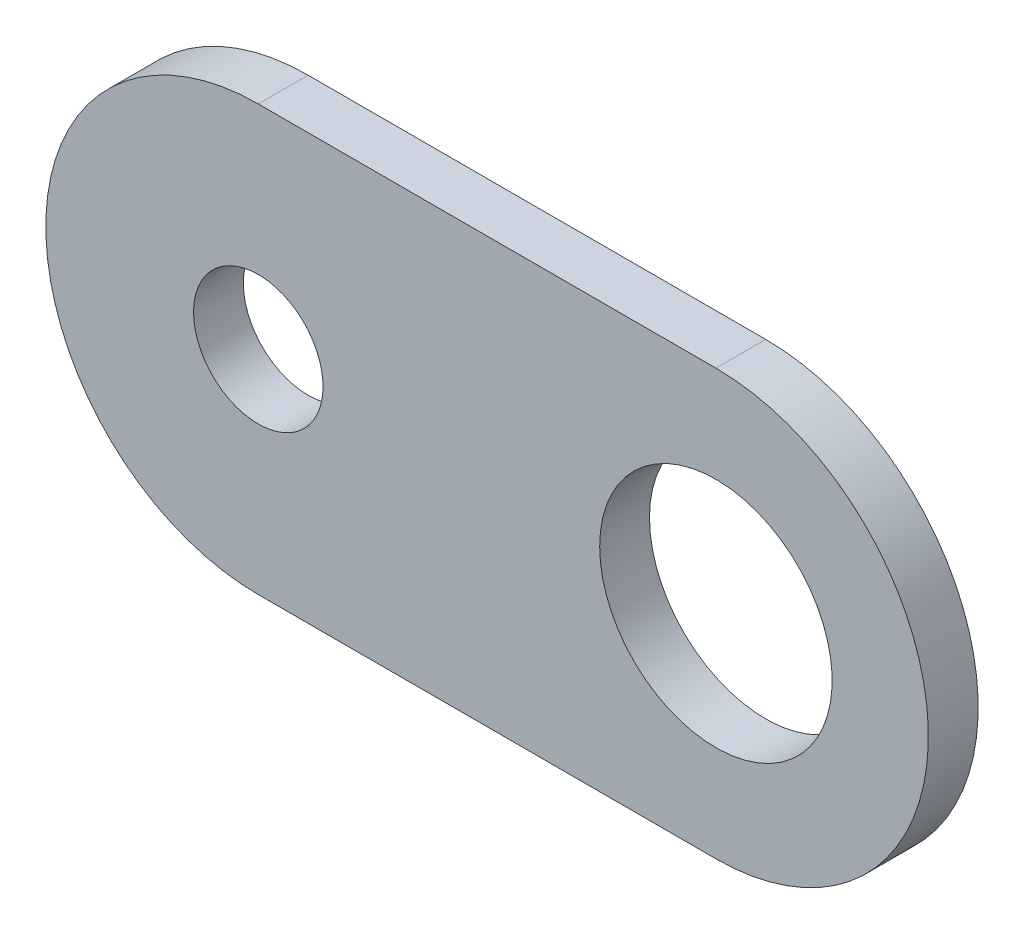
ISO-10303-21;
HEADER;
FILE_DESCRIPTION(('STEP AP214'),'2;1');
FILE_NAME('part.step','',(''),(''),'','','');
FILE_SCHEMA(('AUTOMOTIVE_DESIGN { 1 0 10303 214 1 1 1 1 }'));
ENDSEC;
DATA;
#1=APPLICATION_CONTEXT('core data for automotive mechanical design processes');
#2=APPLICATION_PROTOCOL_DEFINITION('international standard','automotive_design',2000,#1);
#3=PRODUCT_CONTEXT('',#1,'mechanical');
#4=PRODUCT('Part','Part','',(#3));
#5=PRODUCT_RELATED_PRODUCT_CATEGORY('part','',(#4));
#6=PRODUCT_DEFINITION_FORMATION('','',#4);
#7=PRODUCT_DEFINITION_CONTEXT('part definition',#1,'design');
#8=PRODUCT_DEFINITION('design','',#6,#7);
#9=PRODUCT_DEFINITION_SHAPE('','',#8);
#10=(LENGTH_UNIT() NAMED_UNIT(*) SI_UNIT(.MILLI.,.METRE.));
#11=(NAMED_UNIT(*) PLANE_ANGLE_UNIT() SI_UNIT($,.RADIAN.));
#12=(NAMED_UNIT(*) SI_UNIT($,.STERADIAN.) SOLID_ANGLE_UNIT());
#13=UNCERTAINTY_MEASURE_WITH_UNIT(LENGTH_MEASURE(1.E-05),#10,'distance_accuracy_value','');
#14=(GEOMETRIC_REPRESENTATION_CONTEXT(3) GLOBAL_UNCERTAINTY_ASSIGNED_CONTEXT((#13)) GLOBAL_UNIT_ASSIGNED_CONTEXT((#10,
#11,#12)) REPRESENTATION_CONTEXT('',''));
#15=CARTESIAN_POINT('',(0.,0.,0.));
#16=DIRECTION('',(0.,0.,1.));
#17=DIRECTION('',(1.,0.,0.));
#18=AXIS2_PLACEMENT_3D('',#15,#16,#17);
#19=CARTESIAN_POINT('',(-17.5,0.,3.81));
#20=DIRECTION('',(0.,0.,-1.));
#21=DIRECTION('',(-1.,0.,0.));
#22=AXIS2_PLACEMENT_3D('',#19,#20,#21);
#23=PLANE('',#22);
#24=CARTESIAN_POINT('',(-17.5,0.,3.81));
#25=DIRECTION('',(0.,0.,1.));
#26=DIRECTION('',(-1.,0.,0.));
#27=AXIS2_PLACEMENT_3D('',#24,#25,#26);
#28=CIRCLE('',#27,16.250000012);
#29=CARTESIAN_POINT('',(-17.5,16.250000012,3.81));
#30=VERTEX_POINT('',#29);
#31=CARTESIAN_POINT('',(-17.5,-16.250000012,3.81));
#32=VERTEX_POINT('',#31);
#33=EDGE_CURVE('E84',#30,#32,#28,.T.);
#34=ORIENTED_EDGE('',*,*,#33,.T.);
#35=DIRECTION('',(1.,0.,0.));
#36=VECTOR('',#35,1.);
#37=CARTESIAN_POINT('',(17.5,-16.250000012,3.81));
#38=LINE('',#37,#36);
#39=CARTESIAN_POINT('',(17.5,-16.250000012,3.81));
#40=VERTEX_POINT('',#39);
#41=EDGE_CURVE('E79',#32,#40,#38,.T.);
#42=ORIENTED_EDGE('',*,*,#41,.T.);
#43=CARTESIAN_POINT('',(17.5,0.,3.81));
#44=DIRECTION('',(0.,0.,1.));
#45=DIRECTION('',(-1.,0.,0.));
#46=AXIS2_PLACEMENT_3D('',#43,#44,#45);
#47=CIRCLE('',#46,16.250000012);
#48=CARTESIAN_POINT('',(17.5,16.250000012,3.81));
#49=VERTEX_POINT('',#48);
#50=EDGE_CURVE('E82',#40,#49,#47,.T.);
#51=ORIENTED_EDGE('',*,*,#50,.T.);
#52=DIRECTION('',(-1.,0.,0.));
#53=VECTOR('',#52,1.);
#54=CARTESIAN_POINT('',(-17.5,16.250000012,3.81));
#55=LINE('',#54,#53);
#56=EDGE_CURVE('E49',#49,#30,#55,.T.);
#57=ORIENTED_EDGE('',*,*,#56,.T.);
#58=EDGE_LOOP('',(#34,#42,#51,#57));
#59=FACE_BOUND('',#58,.T.);
#60=CARTESIAN_POINT('',(-17.5,0.,3.81));
#61=DIRECTION('',(0.,0.,1.));
#62=DIRECTION('',(1.,0.,0.));
#63=AXIS2_PLACEMENT_3D('',#60,#61,#62);
#64=CIRCLE('',#63,4.953);
#65=CARTESIAN_POINT('',(-22.453,0.,3.81));
#66=VERTEX_POINT('',#65);
#67=EDGE_CURVE('E99',#66,#66,#64,.T.);
#68=ORIENTED_EDGE('',*,*,#67,.F.);
#69=EDGE_LOOP('',(#68));
#70=FACE_BOUND('',#69,.T.);
#71=CARTESIAN_POINT('',(17.5,0.,3.81));
#72=DIRECTION('',(0.,0.,1.));
#73=DIRECTION('',(1.,0.,0.));
#74=AXIS2_PLACEMENT_3D('',#71,#72,#73);
#75=CIRCLE('',#74,8.89000000000001);
#76=CARTESIAN_POINT('',(8.61,0.,3.81));
#77=VERTEX_POINT('',#76);
#78=EDGE_CURVE('E114',#77,#77,#75,.T.);
#79=ORIENTED_EDGE('',*,*,#78,.F.);
#80=EDGE_LOOP('',(#79));
#81=FACE_BOUND('',#80,.T.);
#82=ADVANCED_FACE('F32',(#59,#70,#81),#23,.F.);
#83=CARTESIAN_POINT('',(-17.5,0.,0.));
#84=DIRECTION('',(0.,0.,-1.));
#85=DIRECTION('',(-1.,0.,0.));
#86=AXIS2_PLACEMENT_3D('',#83,#84,#85);
#87=PLANE('',#86);
#88=CARTESIAN_POINT('',(-17.5,0.,0.));
#89=DIRECTION('',(0.,0.,1.));
#90=DIRECTION('',(1.,0.,0.));
#91=AXIS2_PLACEMENT_3D('',#88,#89,#90);
#92=CIRCLE('',#91,4.953);
#93=CARTESIAN_POINT('',(-22.453,0.,0.));
#94=VERTEX_POINT('',#93);
#95=EDGE_CURVE('E111',#94,#94,#92,.T.);
#96=ORIENTED_EDGE('',*,*,#95,.T.);
#97=EDGE_LOOP('',(#96));
#98=FACE_BOUND('',#97,.T.);
#99=CARTESIAN_POINT('',(-17.5,0.,0.));
#100=DIRECTION('',(0.,0.,1.));
#101=DIRECTION('',(-1.,0.,0.));
#102=AXIS2_PLACEMENT_3D('',#99,#100,#101);
#103=CIRCLE('',#102,16.250000012);
#104=CARTESIAN_POINT('',(-17.5,16.250000012,0.));
#105=VERTEX_POINT('',#104);
#106=CARTESIAN_POINT('',(-17.5,-16.250000012,0.));
#107=VERTEX_POINT('',#106);
#108=EDGE_CURVE('E96',#105,#107,#103,.T.);
#109=ORIENTED_EDGE('',*,*,#108,.F.);
#110=DIRECTION('',(-1.,0.,0.));
#111=VECTOR('',#110,1.);
#112=CARTESIAN_POINT('',(-17.5,16.250000012,0.));
#113=LINE('',#112,#111);
#114=CARTESIAN_POINT('',(17.5,16.250000012,0.));
#115=VERTEX_POINT('',#114);
#116=EDGE_CURVE('E72',#115,#105,#113,.T.);
#117=ORIENTED_EDGE('',*,*,#116,.F.);
#118=CARTESIAN_POINT('',(17.5,0.,0.));
#119=DIRECTION('',(0.,0.,1.));
#120=DIRECTION('',(-1.,0.,0.));
#121=AXIS2_PLACEMENT_3D('',#118,#119,#120);
#122=CIRCLE('',#121,16.250000012);
#123=CARTESIAN_POINT('',(17.5,-16.250000012,0.));
#124=VERTEX_POINT('',#123);
#125=EDGE_CURVE('E66',#124,#115,#122,.T.);
#126=ORIENTED_EDGE('',*,*,#125,.F.);
#127=DIRECTION('',(1.,0.,0.));
#128=VECTOR('',#127,1.);
#129=CARTESIAN_POINT('',(17.5,-16.250000012,0.));
#130=LINE('',#129,#128);
#131=EDGE_CURVE('E88',#107,#124,#130,.T.);
#132=ORIENTED_EDGE('',*,*,#131,.F.);
#133=EDGE_LOOP('',(#109,#117,#126,#132));
#134=FACE_BOUND('',#133,.T.);
#135=CARTESIAN_POINT('',(17.5,0.,0.));
#136=DIRECTION('',(0.,0.,1.));
#137=DIRECTION('',(1.,0.,0.));
#138=AXIS2_PLACEMENT_3D('',#135,#136,#137);
#139=CIRCLE('',#138,8.89000000000001);
#140=CARTESIAN_POINT('',(8.61,0.,0.));
#141=VERTEX_POINT('',#140);
#142=EDGE_CURVE('E117',#141,#141,#139,.T.);
#143=ORIENTED_EDGE('',*,*,#142,.T.);
#144=EDGE_LOOP('',(#143));
#145=FACE_BOUND('',#144,.T.);
#146=ADVANCED_FACE('F107',(#98,#134,#145),#87,.T.);
#147=CARTESIAN_POINT('',(-17.5,0.,3.81));
#148=DIRECTION('',(0.,0.,-1.));
#149=DIRECTION('',(-1.,0.,0.));
#150=AXIS2_PLACEMENT_3D('',#147,#148,#149);
#151=CYLINDRICAL_SURFACE('',#150,16.250000012);
#152=ORIENTED_EDGE('',*,*,#108,.T.);
#153=DIRECTION('',(0.,0.,-1.));
#154=VECTOR('',#153,1.);
#155=CARTESIAN_POINT('',(-17.5,-16.250000012,3.81));
#156=LINE('',#155,#154);
#157=EDGE_CURVE('E11',#32,#107,#156,.T.);
#158=ORIENTED_EDGE('',*,*,#157,.F.);
#159=ORIENTED_EDGE('',*,*,#33,.F.);
#160=DIRECTION('',(0.,0.,-1.));
#161=VECTOR('',#160,1.);
#162=CARTESIAN_POINT('',(-17.5,16.250000012,3.81));
#163=LINE('',#162,#161);
#164=EDGE_CURVE('E92',#30,#105,#163,.T.);
#165=ORIENTED_EDGE('',*,*,#164,.T.);
#166=EDGE_LOOP('',(#152,#158,#159,#165));
#167=FACE_BOUND('',#166,.T.);
#168=ADVANCED_FACE('F34',(#167),#151,.T.);
#169=CARTESIAN_POINT('',(17.5,-16.250000012,3.81));
#170=DIRECTION('',(0.,1.,0.));
#171=DIRECTION('',(0.,0.,1.));
#172=AXIS2_PLACEMENT_3D('',#169,#170,#171);
#173=PLANE('',#172);
#174=ORIENTED_EDGE('',*,*,#131,.T.);
#175=DIRECTION('',(0.,0.,-1.));
#176=VECTOR('',#175,1.);
#177=CARTESIAN_POINT('',(17.5,-16.250000012,3.81));
#178=LINE('',#177,#176);
#179=EDGE_CURVE('E41',#40,#124,#178,.T.);
#180=ORIENTED_EDGE('',*,*,#179,.F.);
#181=ORIENTED_EDGE('',*,*,#41,.F.);
#182=ORIENTED_EDGE('',*,*,#157,.T.);
#183=EDGE_LOOP('',(#174,#180,#181,#182));
#184=FACE_BOUND('',#183,.T.);
#185=ADVANCED_FACE('F87',(#184),#173,.F.);
#186=CARTESIAN_POINT('',(17.5,0.,3.81));
#187=DIRECTION('',(0.,0.,-1.));
#188=DIRECTION('',(-1.,0.,0.));
#189=AXIS2_PLACEMENT_3D('',#186,#187,#188);
#190=CYLINDRICAL_SURFACE('',#189,16.250000012);
#191=ORIENTED_EDGE('',*,*,#125,.T.);
#192=DIRECTION('',(0.,0.,-1.));
#193=VECTOR('',#192,1.);
#194=CARTESIAN_POINT('',(17.5,16.250000012,3.81));
#195=LINE('',#194,#193);
#196=EDGE_CURVE('E89',#49,#115,#195,.T.);
#197=ORIENTED_EDGE('',*,*,#196,.F.);
#198=ORIENTED_EDGE('',*,*,#50,.F.);
#199=ORIENTED_EDGE('',*,*,#179,.T.);
#200=EDGE_LOOP('',(#191,#197,#198,#199));
#201=FACE_BOUND('',#200,.T.);
#202=ADVANCED_FACE('F90',(#201),#190,.T.);
#203=CARTESIAN_POINT('',(-17.5,16.250000012,3.81));
#204=DIRECTION('',(0.,-1.,0.));
#205=DIRECTION('',(0.,0.,-1.));
#206=AXIS2_PLACEMENT_3D('',#203,#204,#205);
#207=PLANE('',#206);
#208=ORIENTED_EDGE('',*,*,#116,.T.);
#209=ORIENTED_EDGE('',*,*,#164,.F.);
#210=ORIENTED_EDGE('',*,*,#56,.F.);
#211=ORIENTED_EDGE('',*,*,#196,.T.);
#212=EDGE_LOOP('',(#208,#209,#210,#211));
#213=FACE_BOUND('',#212,.T.);
#214=ADVANCED_FACE('F104',(#213),#207,.F.);
#215=CARTESIAN_POINT('',(-17.5,0.,3.81));
#216=DIRECTION('',(0.,0.,-1.));
#217=DIRECTION('',(-1.,0.,0.));
#218=AXIS2_PLACEMENT_3D('',#215,#216,#217);
#219=CYLINDRICAL_SURFACE('',#218,4.953);
#220=CARTESIAN_POINT('',(-22.453,0.,3.81));
#221=CARTESIAN_POINT('',(-22.453,0.,3.7703125));
#222=CARTESIAN_POINT('',(-22.453,0.,3.730625));
#223=CARTESIAN_POINT('',(-22.453,0.,3.65125));
#224=CARTESIAN_POINT('',(-22.453,0.,3.6115625));
#225=CARTESIAN_POINT('',(-22.453,0.,3.5321875));
#226=CARTESIAN_POINT('',(-22.453,0.,3.4925));
#227=CARTESIAN_POINT('',(-22.453,0.,3.413125));
#228=CARTESIAN_POINT('',(-22.453,0.,3.3734375));
#229=CARTESIAN_POINT('',(-22.453,0.,3.2940625));
#230=CARTESIAN_POINT('',(-22.453,0.,3.254375));
#231=CARTESIAN_POINT('',(-22.453,0.,3.175));
#232=CARTESIAN_POINT('',(-22.453,0.,3.1353125));
#233=CARTESIAN_POINT('',(-22.453,0.,3.0559375));
#234=CARTESIAN_POINT('',(-22.453,0.,3.01625));
#235=CARTESIAN_POINT('',(-22.453,0.,2.936875));
#236=CARTESIAN_POINT('',(-22.453,0.,2.8971875));
#237=CARTESIAN_POINT('',(-22.453,0.,2.8178125));
#238=CARTESIAN_POINT('',(-22.453,0.,2.778125));
#239=CARTESIAN_POINT('',(-22.453,0.,2.69875));
#240=CARTESIAN_POINT('',(-22.453,0.,2.6590625));
#241=CARTESIAN_POINT('',(-22.453,0.,2.5796875));
#242=CARTESIAN_POINT('',(-22.453,0.,2.54));
#243=CARTESIAN_POINT('',(-22.453,0.,2.460625));
#244=CARTESIAN_POINT('',(-22.453,0.,2.4209375));
#245=CARTESIAN_POINT('',(-22.453,0.,2.3415625));
#246=CARTESIAN_POINT('',(-22.453,0.,2.301875));
#247=CARTESIAN_POINT('',(-22.453,0.,2.2225));
#248=CARTESIAN_POINT('',(-22.453,0.,2.1828125));
#249=CARTESIAN_POINT('',(-22.453,0.,2.1034375));
#250=CARTESIAN_POINT('',(-22.453,0.,2.06375));
#251=CARTESIAN_POINT('',(-22.453,0.,1.984375));
#252=CARTESIAN_POINT('',(-22.453,0.,1.9446875));
#253=CARTESIAN_POINT('',(-22.453,0.,1.8653125));
#254=CARTESIAN_POINT('',(-22.453,0.,1.825625));
#255=CARTESIAN_POINT('',(-22.453,0.,1.74625));
#256=CARTESIAN_POINT('',(-22.453,0.,1.7065625));
#257=CARTESIAN_POINT('',(-22.453,0.,1.6271875));
#258=CARTESIAN_POINT('',(-22.453,0.,1.5875));
#259=CARTESIAN_POINT('',(-22.453,0.,1.508125));
#260=CARTESIAN_POINT('',(-22.453,0.,1.4684375));
#261=CARTESIAN_POINT('',(-22.453,0.,1.3890625));
#262=CARTESIAN_POINT('',(-22.453,0.,1.349375));
#263=CARTESIAN_POINT('',(-22.453,0.,1.27));
#264=CARTESIAN_POINT('',(-22.453,0.,1.2303125));
#265=CARTESIAN_POINT('',(-22.453,0.,1.1509375));
#266=CARTESIAN_POINT('',(-22.453,0.,1.11125));
#267=CARTESIAN_POINT('',(-22.453,0.,1.031875));
#268=CARTESIAN_POINT('',(-22.453,0.,0.9921875));
#269=CARTESIAN_POINT('',(-22.453,0.,0.9128125));
#270=CARTESIAN_POINT('',(-22.453,0.,0.873125));
#271=CARTESIAN_POINT('',(-22.453,0.,0.79375));
#272=CARTESIAN_POINT('',(-22.453,0.,0.7540625));
#273=CARTESIAN_POINT('',(-22.453,0.,0.6746875));
#274=CARTESIAN_POINT('',(-22.453,0.,0.635));
#275=CARTESIAN_POINT('',(-22.453,0.,0.555625));
#276=CARTESIAN_POINT('',(-22.453,0.,0.5159375));
#277=CARTESIAN_POINT('',(-22.453,0.,0.4365625));
#278=CARTESIAN_POINT('',(-22.453,0.,0.396875));
#279=CARTESIAN_POINT('',(-22.453,0.,0.3175));
#280=CARTESIAN_POINT('',(-22.453,0.,0.2778125));
#281=CARTESIAN_POINT('',(-22.453,0.,0.1984375));
#282=CARTESIAN_POINT('',(-22.453,0.,0.15875));
#283=CARTESIAN_POINT('',(-22.453,0.,0.0793749999999999));
#284=CARTESIAN_POINT('',(-22.453,0.,0.0396874999999999));
#285=CARTESIAN_POINT('',(-22.453,0.,0.));
#286=B_SPLINE_CURVE_WITH_KNOTS('',3,(#220,#221,#222,#223,#224,#225,#226,#227,#228,#229,#230,
#231,#232,#233,#234,#235,#236,#237,#238,#239,#240,#241,#242,#243,#244,#245,#246,#247,#248,#249,
#250,#251,#252,#253,#254,#255,#256,#257,#258,#259,#260,#261,#262,#263,#264,#265,#266,#267,#268,
#269,#270,#271,#272,#273,#274,#275,#276,#277,#278,#279,#280,#281,#282,#283,#284,#285),
.UNSPECIFIED.,.F.,.F.,(4,2,2,2,2,2,2,2,2,2,2,2,2,2,2,2,2,2,2,2,2,2,2,2,2,2,2,2,2,2,2,2,4),(0.,
0.1190625,0.238125,0.3571875,0.47625,0.595312499999999,0.714375,0.833437499999999,
0.952499999999999,1.0715625,1.190625,1.3096875,1.42875,1.5478125,1.666875,1.7859375,1.905,
2.0240625,2.143125,2.2621875,2.38125,2.5003125,2.619375,2.7384375,2.8575,2.9765625,3.095625,
3.2146875,3.33375,3.4528125,3.571875,3.6909375,3.81),.UNSPECIFIED.);
#287=EDGE_CURVE('BSEAM134',#66,#94,#286,.T.);
#288=ORIENTED_EDGE('',*,*,#67,.T.);
#289=ORIENTED_EDGE('',*,*,#95,.F.);
#290=ORIENTED_EDGE('',*,*,#287,.T.);
#291=ORIENTED_EDGE('',*,*,#287,.F.);
#292=EDGE_LOOP('',(#288,#290,#289,#291));
#293=FACE_BOUND('',#292,.T.);
#294=ADVANCED_FACE('F134',(#293),#219,.F.);
#295=CARTESIAN_POINT('',(17.5,0.,3.81));
#296=DIRECTION('',(0.,0.,-1.));
#297=DIRECTION('',(-1.,0.,0.));
#298=AXIS2_PLACEMENT_3D('',#295,#296,#297);
#299=CYLINDRICAL_SURFACE('',#298,8.89000000000001);
#300=CARTESIAN_POINT('',(8.61,0.,3.81));
#301=CARTESIAN_POINT('',(8.61,0.,3.7703125));
#302=CARTESIAN_POINT('',(8.61,0.,3.730625));
#303=CARTESIAN_POINT('',(8.61,0.,3.65125));
#304=CARTESIAN_POINT('',(8.61,0.,3.6115625));
#305=CARTESIAN_POINT('',(8.61,0.,3.5321875));
#306=CARTESIAN_POINT('',(8.61,0.,3.4925));
#307=CARTESIAN_POINT('',(8.61,0.,3.413125));
#308=CARTESIAN_POINT('',(8.61,0.,3.3734375));
#309=CARTESIAN_POINT('',(8.61,0.,3.2940625));
#310=CARTESIAN_POINT('',(8.61,0.,3.254375));
#311=CARTESIAN_POINT('',(8.61,0.,3.175));
#312=CARTESIAN_POINT('',(8.61,0.,3.1353125));
#313=CARTESIAN_POINT('',(8.61,0.,3.0559375));
#314=CARTESIAN_POINT('',(8.61,0.,3.01625));
#315=CARTESIAN_POINT('',(8.61,0.,2.936875));
#316=CARTESIAN_POINT('',(8.61,0.,2.8971875));
#317=CARTESIAN_POINT('',(8.61,0.,2.8178125));
#318=CARTESIAN_POINT('',(8.61,0.,2.778125));
#319=CARTESIAN_POINT('',(8.61,0.,2.69875));
#320=CARTESIAN_POINT('',(8.61,0.,2.6590625));
#321=CARTESIAN_POINT('',(8.61,0.,2.5796875));
#322=CARTESIAN_POINT('',(8.61,0.,2.54));
#323=CARTESIAN_POINT('',(8.61,0.,2.460625));
#324=CARTESIAN_POINT('',(8.61,0.,2.4209375));
#325=CARTESIAN_POINT('',(8.61,0.,2.3415625));
#326=CARTESIAN_POINT('',(8.61,0.,2.301875));
#327=CARTESIAN_POINT('',(8.61,0.,2.2225));
#328=CARTESIAN_POINT('',(8.61,0.,2.1828125));
#329=CARTESIAN_POINT('',(8.61,0.,2.1034375));
#330=CARTESIAN_POINT('',(8.61,0.,2.06375));
#331=CARTESIAN_POINT('',(8.61,0.,1.984375));
#332=CARTESIAN_POINT('',(8.61,0.,1.9446875));
#333=CARTESIAN_POINT('',(8.61,0.,1.8653125));
#334=CARTESIAN_POINT('',(8.61,0.,1.825625));
#335=CARTESIAN_POINT('',(8.61,0.,1.74625));
#336=CARTESIAN_POINT('',(8.61,0.,1.7065625));
#337=CARTESIAN_POINT('',(8.61,0.,1.6271875));
#338=CARTESIAN_POINT('',(8.61,0.,1.5875));
#339=CARTESIAN_POINT('',(8.61,0.,1.508125));
#340=CARTESIAN_POINT('',(8.61,0.,1.4684375));
#341=CARTESIAN_POINT('',(8.61,0.,1.3890625));
#342=CARTESIAN_POINT('',(8.61,0.,1.349375));
#343=CARTESIAN_POINT('',(8.61,0.,1.27));
#344=CARTESIAN_POINT('',(8.61,0.,1.2303125));
#345=CARTESIAN_POINT('',(8.61,0.,1.1509375));
#346=CARTESIAN_POINT('',(8.61,0.,1.11125));
#347=CARTESIAN_POINT('',(8.61,0.,1.031875));
#348=CARTESIAN_POINT('',(8.61,0.,0.9921875));
#349=CARTESIAN_POINT('',(8.61,0.,0.9128125));
#350=CARTESIAN_POINT('',(8.61,0.,0.873125));
#351=CARTESIAN_POINT('',(8.61,0.,0.79375));
#352=CARTESIAN_POINT('',(8.61,0.,0.7540625));
#353=CARTESIAN_POINT('',(8.61,0.,0.6746875));
#354=CARTESIAN_POINT('',(8.61,0.,0.635));
#355=CARTESIAN_POINT('',(8.61,0.,0.555625));
#356=CARTESIAN_POINT('',(8.61,0.,0.5159375));
#357=CARTESIAN_POINT('',(8.61,0.,0.4365625));
#358=CARTESIAN_POINT('',(8.61,0.,0.396875));
#359=CARTESIAN_POINT('',(8.61,0.,0.3175));
#360=CARTESIAN_POINT('',(8.61,0.,0.2778125));
#361=CARTESIAN_POINT('',(8.61,0.,0.1984375));
#362=CARTESIAN_POINT('',(8.61,0.,0.15875));
#363=CARTESIAN_POINT('',(8.61,0.,0.0793749999999999));
#364=CARTESIAN_POINT('',(8.61,0.,0.0396874999999999));
#365=CARTESIAN_POINT('',(8.61,0.,0.));
#366=B_SPLINE_CURVE_WITH_KNOTS('',3,(#300,#301,#302,#303,#304,#305,#306,#307,#308,#309,#310,
#311,#312,#313,#314,#315,#316,#317,#318,#319,#320,#321,#322,#323,#324,#325,#326,#327,#328,#329,
#330,#331,#332,#333,#334,#335,#336,#337,#338,#339,#340,#341,#342,#343,#344,#345,#346,#347,#348,
#349,#350,#351,#352,#353,#354,#355,#356,#357,#358,#359,#360,#361,#362,#363,#364,#365),
.UNSPECIFIED.,.F.,.F.,(4,2,2,2,2,2,2,2,2,2,2,2,2,2,2,2,2,2,2,2,2,2,2,2,2,2,2,2,2,2,2,2,4),(0.,
0.1190625,0.238125,0.3571875,0.47625,0.5953125,0.714375,0.8334375,0.9525,1.0715625,1.190625,
1.3096875,1.42875,1.5478125,1.666875,1.7859375,1.905,2.0240625,2.143125,2.2621875,2.38125,
2.5003125,2.619375,2.7384375,2.8575,2.9765625,3.095625,3.2146875,3.33375,3.4528125,3.571875,
3.6909375,3.81),.UNSPECIFIED.);
#367=EDGE_CURVE('BSEAM123',#77,#141,#366,.T.);
#368=ORIENTED_EDGE('',*,*,#78,.T.);
#369=ORIENTED_EDGE('',*,*,#142,.F.);
#370=ORIENTED_EDGE('',*,*,#367,.T.);
#371=ORIENTED_EDGE('',*,*,#367,.F.);
#372=EDGE_LOOP('',(#368,#370,#369,#371));
#373=FACE_BOUND('',#372,.T.);
#374=ADVANCED_FACE('F123',(#373),#299,.F.);
#375=CLOSED_SHELL('',(#82,#146,#168,#185,#202,#214,#294,#374));
#376=MANIFOLD_SOLID_BREP('B2',#375);
#377=ADVANCED_BREP_SHAPE_REPRESENTATION('',(#18,#376),#14);
#378=SHAPE_DEFINITION_REPRESENTATION(#9,#377);
ENDSEC;
END-ISO-10303-21;
